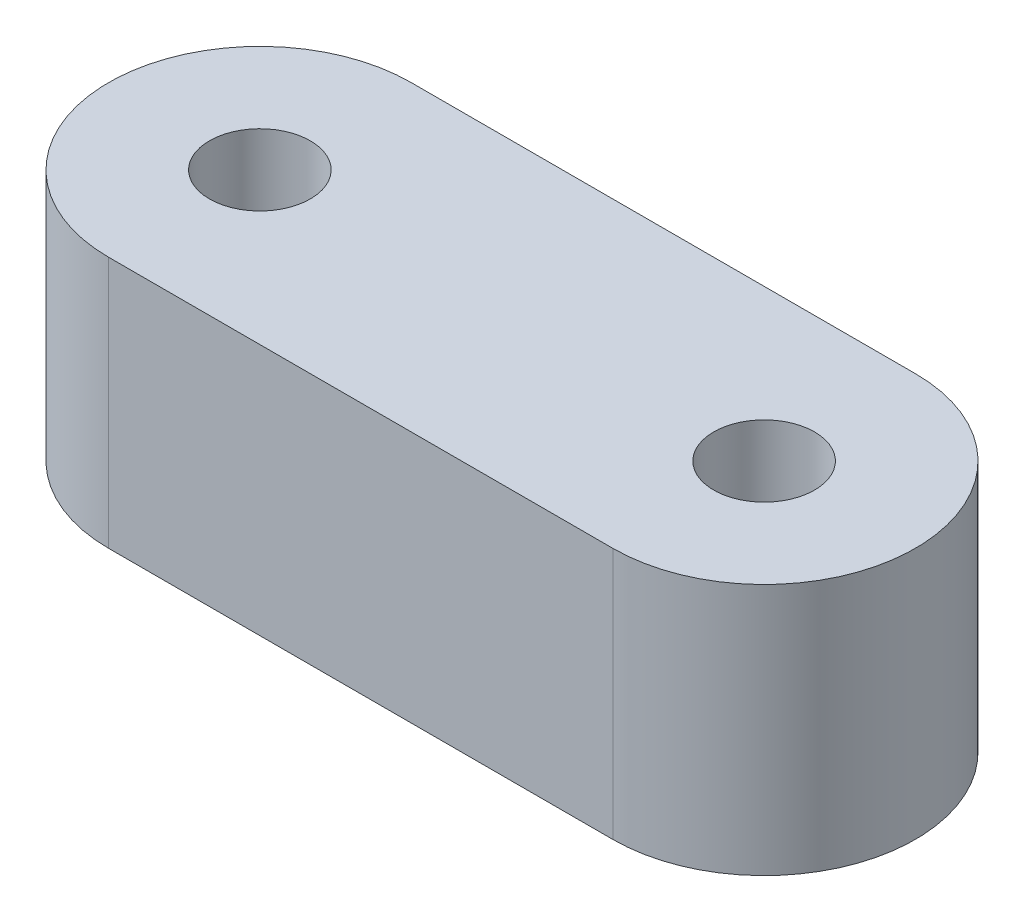
ISO-10303-21;
HEADER;
FILE_DESCRIPTION(('STEP AP214'),'2;1');
FILE_NAME('part.step','',(''),(''),'','','');
FILE_SCHEMA(('AUTOMOTIVE_DESIGN { 1 0 10303 214 1 1 1 1 }'));
ENDSEC;
DATA;
#1=APPLICATION_CONTEXT('core data for automotive mechanical design processes');
#2=APPLICATION_PROTOCOL_DEFINITION('international standard','automotive_design',2000,#1);
#3=PRODUCT_CONTEXT('',#1,'mechanical');
#4=PRODUCT('Part','Part','',(#3));
#5=PRODUCT_RELATED_PRODUCT_CATEGORY('part','',(#4));
#6=PRODUCT_DEFINITION_FORMATION('','',#4);
#7=PRODUCT_DEFINITION_CONTEXT('part definition',#1,'design');
#8=PRODUCT_DEFINITION('design','',#6,#7);
#9=PRODUCT_DEFINITION_SHAPE('','',#8);
#10=(LENGTH_UNIT() NAMED_UNIT(*) SI_UNIT(.MILLI.,.METRE.));
#11=(NAMED_UNIT(*) PLANE_ANGLE_UNIT() SI_UNIT($,.RADIAN.));
#12=(NAMED_UNIT(*) SI_UNIT($,.STERADIAN.) SOLID_ANGLE_UNIT());
#13=UNCERTAINTY_MEASURE_WITH_UNIT(LENGTH_MEASURE(1.E-05),#10,'distance_accuracy_value','');
#14=(GEOMETRIC_REPRESENTATION_CONTEXT(3) GLOBAL_UNCERTAINTY_ASSIGNED_CONTEXT((#13)) GLOBAL_UNIT_ASSIGNED_CONTEXT((#10,
#11,#12)) REPRESENTATION_CONTEXT('',''));
#15=CARTESIAN_POINT('',(0.,0.,0.));
#16=DIRECTION('',(0.,0.,1.));
#17=DIRECTION('',(1.,0.,0.));
#18=AXIS2_PLACEMENT_3D('',#15,#16,#17);
#19=CARTESIAN_POINT('',(-63.5,12.7,0.));
#20=DIRECTION('',(0.,-1.,0.));
#21=DIRECTION('',(0.,0.,-1.));
#22=AXIS2_PLACEMENT_3D('',#19,#20,#21);
#23=CYLINDRICAL_SURFACE('',#22,7.62);
#24=CARTESIAN_POINT('',(-63.5,0.,0.));
#25=DIRECTION('',(0.,1.,0.));
#26=DIRECTION('',(0.,0.,1.));
#27=AXIS2_PLACEMENT_3D('',#24,#25,#26);
#28=CIRCLE('',#27,7.62);
#29=CARTESIAN_POINT('',(-63.5,0.,-7.62));
#30=VERTEX_POINT('',#29);
#31=CARTESIAN_POINT('',(-63.5,0.,7.62));
#32=VERTEX_POINT('',#31);
#33=EDGE_CURVE('E102',#30,#32,#28,.T.);
#34=ORIENTED_EDGE('',*,*,#33,.T.);
#35=DIRECTION('',(0.,-1.,0.));
#36=VECTOR('',#35,1.);
#37=CARTESIAN_POINT('',(-63.5,12.7,7.62));
#38=LINE('',#37,#36);
#39=CARTESIAN_POINT('',(-63.5,12.7,7.62));
#40=VERTEX_POINT('',#39);
#41=EDGE_CURVE('E11',#40,#32,#38,.T.);
#42=ORIENTED_EDGE('',*,*,#41,.F.);
#43=CARTESIAN_POINT('',(-63.5,12.7,0.));
#44=DIRECTION('',(0.,1.,0.));
#45=DIRECTION('',(0.,0.,1.));
#46=AXIS2_PLACEMENT_3D('',#43,#44,#45);
#47=CIRCLE('',#46,7.62);
#48=CARTESIAN_POINT('',(-63.5,12.7,-7.62));
#49=VERTEX_POINT('',#48);
#50=EDGE_CURVE('E90',#49,#40,#47,.T.);
#51=ORIENTED_EDGE('',*,*,#50,.F.);
#52=DIRECTION('',(0.,-1.,0.));
#53=VECTOR('',#52,1.);
#54=CARTESIAN_POINT('',(-63.5,12.7,-7.62));
#55=LINE('',#54,#53);
#56=EDGE_CURVE('E98',#49,#30,#55,.T.);
#57=ORIENTED_EDGE('',*,*,#56,.T.);
#58=EDGE_LOOP('',(#34,#42,#51,#57));
#59=FACE_BOUND('',#58,.T.);
#60=ADVANCED_FACE('F39',(#59),#23,.T.);
#61=CARTESIAN_POINT('',(-63.5,12.7,7.62));
#62=DIRECTION('',(0.,0.,-1.));
#63=DIRECTION('',(-1.,0.,0.));
#64=AXIS2_PLACEMENT_3D('',#61,#62,#63);
#65=PLANE('',#64);
#66=DIRECTION('',(1.,0.,0.));
#67=VECTOR('',#66,1.);
#68=CARTESIAN_POINT('',(-63.5,0.,7.62));
#69=LINE('',#68,#67);
#70=CARTESIAN_POINT('',(-38.1,0.,7.62));
#71=VERTEX_POINT('',#70);
#72=EDGE_CURVE('E94',#32,#71,#69,.T.);
#73=ORIENTED_EDGE('',*,*,#72,.T.);
#74=DIRECTION('',(0.,-1.,0.));
#75=VECTOR('',#74,1.);
#76=CARTESIAN_POINT('',(-38.1,12.7,7.62));
#77=LINE('',#76,#75);
#78=CARTESIAN_POINT('',(-38.1,12.7,7.62));
#79=VERTEX_POINT('',#78);
#80=EDGE_CURVE('E47',#79,#71,#77,.T.);
#81=ORIENTED_EDGE('',*,*,#80,.F.);
#82=DIRECTION('',(1.,0.,0.));
#83=VECTOR('',#82,1.);
#84=CARTESIAN_POINT('',(-63.5,12.7,7.62));
#85=LINE('',#84,#83);
#86=EDGE_CURVE('E85',#40,#79,#85,.T.);
#87=ORIENTED_EDGE('',*,*,#86,.F.);
#88=ORIENTED_EDGE('',*,*,#41,.T.);
#89=EDGE_LOOP('',(#73,#81,#87,#88));
#90=FACE_BOUND('',#89,.T.);
#91=ADVANCED_FACE('F93',(#90),#65,.F.);
#92=CARTESIAN_POINT('',(-38.1,12.7,0.));
#93=DIRECTION('',(0.,-1.,0.));
#94=DIRECTION('',(0.,0.,-1.));
#95=AXIS2_PLACEMENT_3D('',#92,#93,#94);
#96=CYLINDRICAL_SURFACE('',#95,7.62);
#97=CARTESIAN_POINT('',(-38.1,0.,0.));
#98=DIRECTION('',(0.,1.,0.));
#99=DIRECTION('',(0.,0.,1.));
#100=AXIS2_PLACEMENT_3D('',#97,#98,#99);
#101=CIRCLE('',#100,7.62);
#102=CARTESIAN_POINT('',(-38.1,0.,-7.62));
#103=VERTEX_POINT('',#102);
#104=EDGE_CURVE('E72',#71,#103,#101,.T.);
#105=ORIENTED_EDGE('',*,*,#104,.T.);
#106=DIRECTION('',(0.,-1.,0.));
#107=VECTOR('',#106,1.);
#108=CARTESIAN_POINT('',(-38.1,12.7,-7.62));
#109=LINE('',#108,#107);
#110=CARTESIAN_POINT('',(-38.1,12.7,-7.62));
#111=VERTEX_POINT('',#110);
#112=EDGE_CURVE('E95',#111,#103,#109,.T.);
#113=ORIENTED_EDGE('',*,*,#112,.F.);
#114=CARTESIAN_POINT('',(-38.1,12.7,0.));
#115=DIRECTION('',(0.,1.,0.));
#116=DIRECTION('',(0.,0.,1.));
#117=AXIS2_PLACEMENT_3D('',#114,#115,#116);
#118=CIRCLE('',#117,7.62);
#119=EDGE_CURVE('E88',#79,#111,#118,.T.);
#120=ORIENTED_EDGE('',*,*,#119,.F.);
#121=ORIENTED_EDGE('',*,*,#80,.T.);
#122=EDGE_LOOP('',(#105,#113,#120,#121));
#123=FACE_BOUND('',#122,.T.);
#124=ADVANCED_FACE('F96',(#123),#96,.T.);
#125=CARTESIAN_POINT('',(-63.5,12.7,-7.62));
#126=DIRECTION('',(0.,0.,1.));
#127=DIRECTION('',(1.,0.,0.));
#128=AXIS2_PLACEMENT_3D('',#125,#126,#127);
#129=PLANE('',#128);
#130=DIRECTION('',(-1.,0.,0.));
#131=VECTOR('',#130,1.);
#132=CARTESIAN_POINT('',(-63.5,0.,-7.62));
#133=LINE('',#132,#131);
#134=EDGE_CURVE('E78',#103,#30,#133,.T.);
#135=ORIENTED_EDGE('',*,*,#134,.T.);
#136=ORIENTED_EDGE('',*,*,#56,.F.);
#137=DIRECTION('',(-1.,0.,0.));
#138=VECTOR('',#137,1.);
#139=CARTESIAN_POINT('',(-63.5,12.7,-7.62));
#140=LINE('',#139,#138);
#141=EDGE_CURVE('E55',#111,#49,#140,.T.);
#142=ORIENTED_EDGE('',*,*,#141,.F.);
#143=ORIENTED_EDGE('',*,*,#112,.T.);
#144=EDGE_LOOP('',(#135,#136,#142,#143));
#145=FACE_BOUND('',#144,.T.);
#146=ADVANCED_FACE('F110',(#145),#129,.F.);
#147=CARTESIAN_POINT('',(-63.5,12.7,0.));
#148=DIRECTION('',(0.,1.,0.));
#149=DIRECTION('',(0.,0.,1.));
#150=AXIS2_PLACEMENT_3D('',#147,#148,#149);
#151=PLANE('',#150);
#152=CARTESIAN_POINT('',(-63.5,12.7,0.));
#153=DIRECTION('',(0.,1.,0.));
#154=DIRECTION('',(0.,0.,1.));
#155=AXIS2_PLACEMENT_3D('',#152,#153,#154);
#156=CIRCLE('',#155,2.54);
#157=CARTESIAN_POINT('',(-63.5,12.7,2.54));
#158=VERTEX_POINT('',#157);
#159=EDGE_CURVE('E122',#158,#158,#156,.T.);
#160=ORIENTED_EDGE('',*,*,#159,.F.);
#161=EDGE_LOOP('',(#160));
#162=FACE_BOUND('',#161,.T.);
#163=CARTESIAN_POINT('',(-38.1,12.7,0.));
#164=DIRECTION('',(0.,1.,0.));
#165=DIRECTION('',(0.,0.,-1.));
#166=AXIS2_PLACEMENT_3D('',#163,#164,#165);
#167=CIRCLE('',#166,2.54);
#168=CARTESIAN_POINT('',(-38.1,12.7,-2.54));
#169=VERTEX_POINT('',#168);
#170=EDGE_CURVE('E119',#169,#169,#167,.T.);
#171=ORIENTED_EDGE('',*,*,#170,.F.);
#172=EDGE_LOOP('',(#171));
#173=FACE_BOUND('',#172,.T.);
#174=ORIENTED_EDGE('',*,*,#50,.T.);
#175=ORIENTED_EDGE('',*,*,#86,.T.);
#176=ORIENTED_EDGE('',*,*,#119,.T.);
#177=ORIENTED_EDGE('',*,*,#141,.T.);
#178=EDGE_LOOP('',(#174,#175,#176,#177));
#179=FACE_BOUND('',#178,.T.);
#180=ADVANCED_FACE('F86',(#162,#173,#179),#151,.T.);
#181=CARTESIAN_POINT('',(-63.5,0.,0.));
#182=DIRECTION('',(0.,1.,0.));
#183=DIRECTION('',(0.,0.,1.));
#184=AXIS2_PLACEMENT_3D('',#181,#182,#183);
#185=PLANE('',#184);
#186=CARTESIAN_POINT('',(-63.5,0.,0.));
#187=DIRECTION('',(0.,1.,0.));
#188=DIRECTION('',(0.,0.,1.));
#189=AXIS2_PLACEMENT_3D('',#186,#187,#188);
#190=CIRCLE('',#189,2.54);
#191=CARTESIAN_POINT('',(-63.5,0.,2.54));
#192=VERTEX_POINT('',#191);
#193=EDGE_CURVE('E105',#192,#192,#190,.T.);
#194=ORIENTED_EDGE('',*,*,#193,.T.);
#195=EDGE_LOOP('',(#194));
#196=FACE_BOUND('',#195,.T.);
#197=CARTESIAN_POINT('',(-38.1,0.,0.));
#198=DIRECTION('',(0.,1.,0.));
#199=DIRECTION('',(0.,0.,-1.));
#200=AXIS2_PLACEMENT_3D('',#197,#198,#199);
#201=CIRCLE('',#200,2.54);
#202=CARTESIAN_POINT('',(-38.1,0.,-2.54));
#203=VERTEX_POINT('',#202);
#204=EDGE_CURVE('E116',#203,#203,#201,.T.);
#205=ORIENTED_EDGE('',*,*,#204,.T.);
#206=EDGE_LOOP('',(#205));
#207=FACE_BOUND('',#206,.T.);
#208=ORIENTED_EDGE('',*,*,#33,.F.);
#209=ORIENTED_EDGE('',*,*,#134,.F.);
#210=ORIENTED_EDGE('',*,*,#104,.F.);
#211=ORIENTED_EDGE('',*,*,#72,.F.);
#212=EDGE_LOOP('',(#208,#209,#210,#211));
#213=FACE_BOUND('',#212,.T.);
#214=ADVANCED_FACE('F113',(#196,#207,#213),#185,.F.);
#215=CARTESIAN_POINT('',(-38.1,0.,0.));
#216=DIRECTION('',(0.,1.,0.));
#217=DIRECTION('',(0.,0.,1.));
#218=AXIS2_PLACEMENT_3D('',#215,#216,#217);
#219=CYLINDRICAL_SURFACE('',#218,2.54);
#220=ORIENTED_EDGE('',*,*,#204,.F.);
#221=EDGE_LOOP('',(#220));
#222=FACE_BOUND('',#221,.T.);
#223=ORIENTED_EDGE('',*,*,#170,.T.);
#224=EDGE_LOOP('',(#223));
#225=FACE_BOUND('',#224,.T.);
#226=ADVANCED_FACE('F133',(#222,#225),#219,.F.);
#227=CARTESIAN_POINT('',(-63.5,0.,0.));
#228=DIRECTION('',(0.,1.,0.));
#229=DIRECTION('',(0.,0.,1.));
#230=AXIS2_PLACEMENT_3D('',#227,#228,#229);
#231=CYLINDRICAL_SURFACE('',#230,2.54);
#232=ORIENTED_EDGE('',*,*,#193,.F.);
#233=EDGE_LOOP('',(#232));
#234=FACE_BOUND('',#233,.T.);
#235=ORIENTED_EDGE('',*,*,#159,.T.);
#236=EDGE_LOOP('',(#235));
#237=FACE_BOUND('',#236,.T.);
#238=ADVANCED_FACE('F130',(#234,#237),#231,.F.);
#239=CLOSED_SHELL('',(#60,#91,#124,#146,#180,#214,#226,#238));
#240=MANIFOLD_SOLID_BREP('B2',#239);
#241=ADVANCED_BREP_SHAPE_REPRESENTATION('',(#18,#240),#14);
#242=SHAPE_DEFINITION_REPRESENTATION(#9,#241);
ENDSEC;
END-ISO-10303-21;
